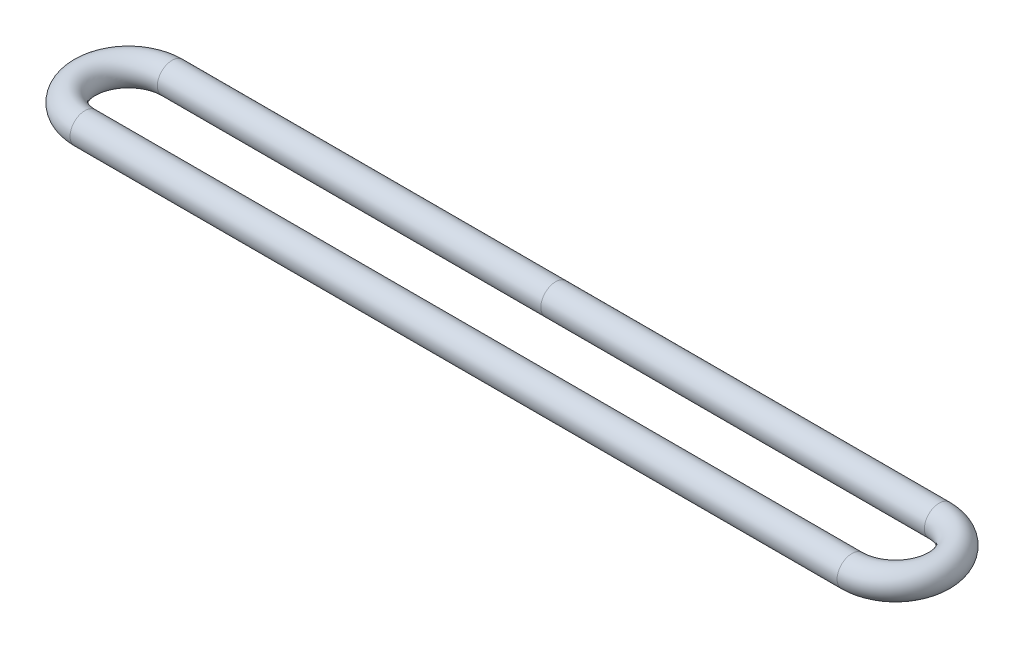
ISO-10303-21;
HEADER;
FILE_DESCRIPTION(('STEP AP214'),'2;1');
FILE_NAME('part.step','',(''),(''),'','','');
FILE_SCHEMA(('AUTOMOTIVE_DESIGN { 1 0 10303 214 1 1 1 1 }'));
ENDSEC;
DATA;
#1=APPLICATION_CONTEXT('core data for automotive mechanical design processes');
#2=APPLICATION_PROTOCOL_DEFINITION('international standard','automotive_design',2000,#1);
#3=PRODUCT_CONTEXT('',#1,'mechanical');
#4=PRODUCT('Part','Part','',(#3));
#5=PRODUCT_RELATED_PRODUCT_CATEGORY('part','',(#4));
#6=PRODUCT_DEFINITION_FORMATION('','',#4);
#7=PRODUCT_DEFINITION_CONTEXT('part definition',#1,'design');
#8=PRODUCT_DEFINITION('design','',#6,#7);
#9=PRODUCT_DEFINITION_SHAPE('','',#8);
#10=(LENGTH_UNIT() NAMED_UNIT(*) SI_UNIT(.MILLI.,.METRE.));
#11=(NAMED_UNIT(*) PLANE_ANGLE_UNIT() SI_UNIT($,.RADIAN.));
#12=(NAMED_UNIT(*) SI_UNIT($,.STERADIAN.) SOLID_ANGLE_UNIT());
#13=UNCERTAINTY_MEASURE_WITH_UNIT(LENGTH_MEASURE(1.E-05),#10,'distance_accuracy_value','');
#14=(GEOMETRIC_REPRESENTATION_CONTEXT(3) GLOBAL_UNCERTAINTY_ASSIGNED_CONTEXT((#13)) GLOBAL_UNIT_ASSIGNED_CONTEXT((#10,
#11,#12)) REPRESENTATION_CONTEXT('',''));
#15=CARTESIAN_POINT('',(0.,0.,0.));
#16=DIRECTION('',(0.,0.,1.));
#17=DIRECTION('',(1.,0.,0.));
#18=AXIS2_PLACEMENT_3D('',#15,#16,#17);
#19=CARTESIAN_POINT('',(0.,0.,-2.38125));
#20=DIRECTION('',(-1.,0.,0.));
#21=DIRECTION('',(0.,0.,1.));
#22=AXIS2_PLACEMENT_3D('',#19,#20,#21);
#23=CYLINDRICAL_SURFACE('',#22,2.38125);
#24=CARTESIAN_POINT('',(-61.7221568150628,0.,-2.38125));
#25=DIRECTION('',(1.,0.,0.));
#26=DIRECTION('',(0.,0.,-1.));
#27=AXIS2_PLACEMENT_3D('',#24,#25,#26);
#28=CIRCLE('',#27,2.38125);
#29=CARTESIAN_POINT('',(-61.7221568150628,0.,-4.7625));
#30=VERTEX_POINT('',#29);
#31=EDGE_CURVE('E46',#30,#30,#28,.T.);
#32=ORIENTED_EDGE('',*,*,#31,.T.);
#33=EDGE_LOOP('',(#32));
#34=FACE_BOUND('',#33,.T.);
#35=CARTESIAN_POINT('',(0.,0.,-2.38125));
#36=DIRECTION('',(1.,0.,0.));
#37=DIRECTION('',(0.,0.,-1.));
#38=AXIS2_PLACEMENT_3D('',#35,#36,#37);
#39=CIRCLE('',#38,2.38125);
#40=CARTESIAN_POINT('',(0.,0.,-4.7625));
#41=VERTEX_POINT('',#40);
#42=EDGE_CURVE('E51',#41,#41,#39,.T.);
#43=ORIENTED_EDGE('',*,*,#42,.F.);
#44=EDGE_LOOP('',(#43));
#45=FACE_BOUND('',#44,.T.);
#46=ADVANCED_FACE('F31',(#34,#45),#23,.T.);
#47=CARTESIAN_POINT('',(-61.7221568150628,0.,4.64073098503559));
#48=DIRECTION('',(0.,1.,0.));
#49=DIRECTION('',(0.,0.,1.));
#50=AXIS2_PLACEMENT_3D('',#47,#48,#49);
#51=TOROIDAL_SURFACE('',#50,7.02198098503559,2.38125);
#52=CARTESIAN_POINT('',(-61.7221568150628,0.,11.6627119700712));
#53=DIRECTION('',(-1.,0.,0.));
#54=DIRECTION('',(0.,0.,1.));
#55=AXIS2_PLACEMENT_3D('',#52,#53,#54);
#56=CIRCLE('',#55,2.38125);
#57=CARTESIAN_POINT('',(-61.7221568150628,0.,14.0439619700712));
#58=VERTEX_POINT('',#57);
#59=EDGE_CURVE('E42',#58,#58,#56,.T.);
#60=CARTESIAN_POINT('',(-61.7221568150628,0.,4.64073098503559));
#61=DIRECTION('',(0.,1.,0.));
#62=DIRECTION('',(0.,0.,1.));
#63=AXIS2_PLACEMENT_3D('',#60,#61,#62);
#64=CIRCLE('',#63,9.40323098503559);
#65=EDGE_CURVE('',#30,#58,#64,.T.);
#66=ORIENTED_EDGE('',*,*,#31,.F.);
#67=ORIENTED_EDGE('',*,*,#59,.T.);
#68=ORIENTED_EDGE('',*,*,#65,.T.);
#69=ORIENTED_EDGE('',*,*,#65,.F.);
#70=EDGE_LOOP('',(#66,#68,#67,#69));
#71=FACE_BOUND('',#70,.T.);
#72=ADVANCED_FACE('F58',(#71),#51,.T.);
#73=CARTESIAN_POINT('',(-61.7221568150628,0.,11.6627119700712));
#74=DIRECTION('',(1.,0.,0.));
#75=DIRECTION('',(0.,0.,-1.));
#76=AXIS2_PLACEMENT_3D('',#73,#74,#75);
#77=CYLINDRICAL_SURFACE('',#76,2.38125);
#78=CARTESIAN_POINT('',(61.7221568150628,0.,11.6627119700712));
#79=DIRECTION('',(-1.,0.,0.));
#80=DIRECTION('',(0.,0.,1.));
#81=AXIS2_PLACEMENT_3D('',#78,#79,#80);
#82=CIRCLE('',#81,2.38125);
#83=CARTESIAN_POINT('',(61.7221568150628,0.,14.0439619700712));
#84=VERTEX_POINT('',#83);
#85=EDGE_CURVE('E38',#84,#84,#82,.T.);
#86=ORIENTED_EDGE('',*,*,#85,.T.);
#87=EDGE_LOOP('',(#86));
#88=FACE_BOUND('',#87,.T.);
#89=ORIENTED_EDGE('',*,*,#59,.F.);
#90=EDGE_LOOP('',(#89));
#91=FACE_BOUND('',#90,.T.);
#92=ADVANCED_FACE('F64',(#88,#91),#77,.T.);
#93=CARTESIAN_POINT('',(61.7221568150628,0.,4.64073098503559));
#94=DIRECTION('',(0.,1.,0.));
#95=DIRECTION('',(0.,0.,1.));
#96=AXIS2_PLACEMENT_3D('',#93,#94,#95);
#97=TOROIDAL_SURFACE('',#96,7.02198098503559,2.38125);
#98=CARTESIAN_POINT('',(61.7221568150628,0.,-2.38125));
#99=DIRECTION('',(1.,0.,0.));
#100=DIRECTION('',(0.,0.,-1.));
#101=AXIS2_PLACEMENT_3D('',#98,#99,#100);
#102=CIRCLE('',#101,2.38125);
#103=CARTESIAN_POINT('',(61.7221568150628,0.,-4.7625));
#104=VERTEX_POINT('',#103);
#105=EDGE_CURVE('E10',#104,#104,#102,.T.);
#106=CARTESIAN_POINT('',(61.7221568150628,0.,4.64073098503559));
#107=DIRECTION('',(0.,1.,0.));
#108=DIRECTION('',(0.,0.,1.));
#109=AXIS2_PLACEMENT_3D('',#106,#107,#108);
#110=CIRCLE('',#109,9.40323098503559);
#111=EDGE_CURVE('',#84,#104,#110,.T.);
#112=ORIENTED_EDGE('',*,*,#85,.F.);
#113=ORIENTED_EDGE('',*,*,#105,.T.);
#114=ORIENTED_EDGE('',*,*,#111,.T.);
#115=ORIENTED_EDGE('',*,*,#111,.F.);
#116=EDGE_LOOP('',(#112,#114,#113,#115));
#117=FACE_BOUND('',#116,.T.);
#118=ADVANCED_FACE('F69',(#117),#97,.T.);
#119=CARTESIAN_POINT('',(61.7221568150628,0.,-2.38125));
#120=DIRECTION('',(-1.,0.,0.));
#121=DIRECTION('',(0.,0.,1.));
#122=AXIS2_PLACEMENT_3D('',#119,#120,#121);
#123=CYLINDRICAL_SURFACE('',#122,2.38125);
#124=ORIENTED_EDGE('',*,*,#42,.T.);
#125=EDGE_LOOP('',(#124));
#126=FACE_BOUND('',#125,.T.);
#127=ORIENTED_EDGE('',*,*,#105,.F.);
#128=EDGE_LOOP('',(#127));
#129=FACE_BOUND('',#128,.T.);
#130=ADVANCED_FACE('F33',(#126,#129),#123,.T.);
#131=CLOSED_SHELL('',(#46,#72,#92,#118,#130));
#132=MANIFOLD_SOLID_BREP('B2',#131);
#133=ADVANCED_BREP_SHAPE_REPRESENTATION('',(#18,#132),#14);
#134=SHAPE_DEFINITION_REPRESENTATION(#9,#133);
ENDSEC;
END-ISO-10303-21;
